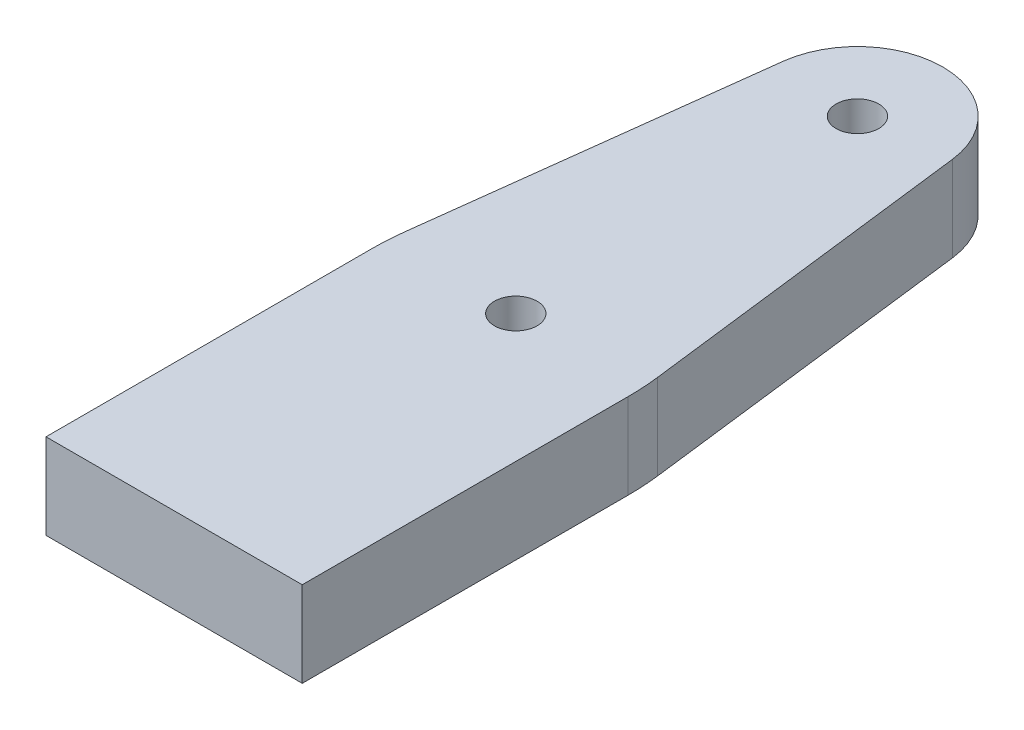
ISO-10303-21;
HEADER;
FILE_DESCRIPTION(('STEP AP214'),'2;1');
FILE_NAME('part.step','',(''),(''),'','','');
FILE_SCHEMA(('AUTOMOTIVE_DESIGN { 1 0 10303 214 1 1 1 1 }'));
ENDSEC;
DATA;
#1=APPLICATION_CONTEXT('core data for automotive mechanical design processes');
#2=APPLICATION_PROTOCOL_DEFINITION('international standard','automotive_design',2000,#1);
#3=PRODUCT_CONTEXT('',#1,'mechanical');
#4=PRODUCT('Part','Part','',(#3));
#5=PRODUCT_RELATED_PRODUCT_CATEGORY('part','',(#4));
#6=PRODUCT_DEFINITION_FORMATION('','',#4);
#7=PRODUCT_DEFINITION_CONTEXT('part definition',#1,'design');
#8=PRODUCT_DEFINITION('design','',#6,#7);
#9=PRODUCT_DEFINITION_SHAPE('','',#8);
#10=(LENGTH_UNIT() NAMED_UNIT(*) SI_UNIT(.MILLI.,.METRE.));
#11=(NAMED_UNIT(*) PLANE_ANGLE_UNIT() SI_UNIT($,.RADIAN.));
#12=(NAMED_UNIT(*) SI_UNIT($,.STERADIAN.) SOLID_ANGLE_UNIT());
#13=UNCERTAINTY_MEASURE_WITH_UNIT(LENGTH_MEASURE(1.E-05),#10,'distance_accuracy_value','');
#14=(GEOMETRIC_REPRESENTATION_CONTEXT(3) GLOBAL_UNCERTAINTY_ASSIGNED_CONTEXT((#13)) GLOBAL_UNIT_ASSIGNED_CONTEXT((#10,
#11,#12)) REPRESENTATION_CONTEXT('',''));
#15=CARTESIAN_POINT('',(0.,0.,0.));
#16=DIRECTION('',(0.,0.,1.));
#17=DIRECTION('',(1.,0.,0.));
#18=AXIS2_PLACEMENT_3D('',#15,#16,#17);
#19=CARTESIAN_POINT('',(4.96253362351675,5.,-0.610950108818783));
#20=DIRECTION('',(-0.992506724703351,0.,0.122190021763757));
#21=DIRECTION('',(0.122190021763757,0.,0.992506724703351));
#22=AXIS2_PLACEMENT_3D('',#19,#20,#21);
#23=PLANE('',#22);
#24=DIRECTION('',(-0.122190021763757,0.,-0.992506724703351));
#25=VECTOR('',#24,1.);
#26=CARTESIAN_POINT('',(4.96253362351675,5.,-0.610950108818783));
#27=LINE('',#26,#25);
#28=CARTESIAN_POINT('',(7.38760087055026,5.,19.0870212622979));
#29=VERTEX_POINT('',#28);
#30=CARTESIAN_POINT('',(4.96253362351675,5.,-0.610950108818783));
#31=VERTEX_POINT('',#30);
#32=EDGE_CURVE('E100',#29,#31,#27,.T.);
#33=ORIENTED_EDGE('',*,*,#32,.F.);
#34=DIRECTION('',(0.,-1.,0.));
#35=VECTOR('',#34,1.);
#36=CARTESIAN_POINT('',(7.38760087055026,0.,19.0870212622979));
#37=LINE('',#36,#35);
#38=CARTESIAN_POINT('',(7.38760087055026,0.,19.0870212622979));
#39=VERTEX_POINT('',#38);
#40=EDGE_CURVE('E125',#29,#39,#37,.T.);
#41=ORIENTED_EDGE('',*,*,#40,.T.);
#42=DIRECTION('',(-0.122190021763757,0.,-0.992506724703351));
#43=VECTOR('',#42,1.);
#44=CARTESIAN_POINT('',(4.96253362351675,0.,-0.610950108818783));
#45=LINE('',#44,#43);
#46=CARTESIAN_POINT('',(4.96253362351675,0.,-0.610950108818783));
#47=VERTEX_POINT('',#46);
#48=EDGE_CURVE('E123',#39,#47,#45,.T.);
#49=ORIENTED_EDGE('',*,*,#48,.T.);
#50=DIRECTION('',(0.,-1.,0.));
#51=VECTOR('',#50,1.);
#52=CARTESIAN_POINT('',(4.96253362351675,5.,-0.610950108818783));
#53=LINE('',#52,#51);
#54=EDGE_CURVE('E117',#31,#47,#53,.T.);
#55=ORIENTED_EDGE('',*,*,#54,.F.);
#56=EDGE_LOOP('',(#33,#41,#49,#55));
#57=FACE_BOUND('',#56,.T.);
#58=ADVANCED_FACE('F37',(#57),#23,.F.);
#59=CARTESIAN_POINT('',(0.,5.,0.));
#60=DIRECTION('',(0.,-1.,0.));
#61=DIRECTION('',(0.,0.,-1.));
#62=AXIS2_PLACEMENT_3D('',#59,#60,#61);
#63=CYLINDRICAL_SURFACE('',#62,5.);
#64=CARTESIAN_POINT('',(0.,0.,0.));
#65=DIRECTION('',(0.,1.,0.));
#66=DIRECTION('',(0.,0.,1.));
#67=AXIS2_PLACEMENT_3D('',#64,#65,#66);
#68=CIRCLE('',#67,5.);
#69=CARTESIAN_POINT('',(-4.96253362351675,0.,-0.610950108818782));
#70=VERTEX_POINT('',#69);
#71=EDGE_CURVE('E158',#47,#70,#68,.T.);
#72=ORIENTED_EDGE('',*,*,#71,.T.);
#73=DIRECTION('',(0.,-1.,0.));
#74=VECTOR('',#73,1.);
#75=CARTESIAN_POINT('',(-4.96253362351675,5.,-0.610950108818782));
#76=LINE('',#75,#74);
#77=CARTESIAN_POINT('',(-4.96253362351675,5.,-0.610950108818782));
#78=VERTEX_POINT('',#77);
#79=EDGE_CURVE('E119',#78,#70,#76,.T.);
#80=ORIENTED_EDGE('',*,*,#79,.F.);
#81=CARTESIAN_POINT('',(0.,5.,0.));
#82=DIRECTION('',(0.,1.,0.));
#83=DIRECTION('',(0.,0.,1.));
#84=AXIS2_PLACEMENT_3D('',#81,#82,#83);
#85=CIRCLE('',#84,5.);
#86=EDGE_CURVE('E104',#31,#78,#85,.T.);
#87=ORIENTED_EDGE('',*,*,#86,.F.);
#88=ORIENTED_EDGE('',*,*,#54,.T.);
#89=EDGE_LOOP('',(#72,#80,#87,#88));
#90=FACE_BOUND('',#89,.T.);
#91=ADVANCED_FACE('F116',(#90),#63,.T.);
#92=CARTESIAN_POINT('',(-4.96253362351675,5.,-0.610950108818782));
#93=DIRECTION('',(0.992506724703351,0.,0.122190021763756));
#94=DIRECTION('',(0.122190021763756,0.,-0.992506724703351));
#95=AXIS2_PLACEMENT_3D('',#92,#93,#94);
#96=PLANE('',#95);
#97=DIRECTION('',(-0.122190021763756,0.,0.992506724703351));
#98=VECTOR('',#97,1.);
#99=CARTESIAN_POINT('',(-4.96253362351675,0.,-0.610950108818782));
#100=LINE('',#99,#98);
#101=CARTESIAN_POINT('',(-7.38760087055026,0.,19.0870212622979));
#102=VERTEX_POINT('',#101);
#103=EDGE_CURVE('E155',#70,#102,#100,.T.);
#104=ORIENTED_EDGE('',*,*,#103,.T.);
#105=DIRECTION('',(0.,-1.,0.));
#106=VECTOR('',#105,1.);
#107=CARTESIAN_POINT('',(-7.38760087055026,5.,19.0870212622979));
#108=LINE('',#107,#106);
#109=CARTESIAN_POINT('',(-7.38760087055026,5.,19.0870212622979));
#110=VERTEX_POINT('',#109);
#111=EDGE_CURVE('E11',#102,#110,#108,.F.);
#112=ORIENTED_EDGE('',*,*,#111,.T.);
#113=DIRECTION('',(-0.122190021763756,0.,0.992506724703351));
#114=VECTOR('',#113,1.);
#115=CARTESIAN_POINT('',(-4.96253362351675,5.,-0.610950108818782));
#116=LINE('',#115,#114);
#117=EDGE_CURVE('E120',#78,#110,#116,.T.);
#118=ORIENTED_EDGE('',*,*,#117,.F.);
#119=ORIENTED_EDGE('',*,*,#79,.T.);
#120=EDGE_LOOP('',(#104,#112,#118,#119));
#121=FACE_BOUND('',#120,.T.);
#122=ADVANCED_FACE('F178',(#121),#96,.F.);
#123=CARTESIAN_POINT('',(-7.5,5.,0.));
#124=DIRECTION('',(1.,0.,0.));
#125=DIRECTION('',(0.,0.,-1.));
#126=AXIS2_PLACEMENT_3D('',#123,#124,#125);
#127=PLANE('',#126);
#128=DIRECTION('',(0.,0.,1.));
#129=VECTOR('',#128,1.);
#130=CARTESIAN_POINT('',(-7.5,5.,0.));
#131=LINE('',#130,#129);
#132=CARTESIAN_POINT('',(-7.5,5.,20.9198715887542));
#133=VERTEX_POINT('',#132);
#134=CARTESIAN_POINT('',(-7.49999999999999,5.,40.));
#135=VERTEX_POINT('',#134);
#136=EDGE_CURVE('E147',#133,#135,#131,.T.);
#137=ORIENTED_EDGE('',*,*,#136,.F.);
#138=DIRECTION('',(0.,-1.,0.));
#139=VECTOR('',#138,1.);
#140=CARTESIAN_POINT('',(-7.5,5.,20.9198715887542));
#141=LINE('',#140,#139);
#142=CARTESIAN_POINT('',(-7.5,0.,20.9198715887542));
#143=VERTEX_POINT('',#142);
#144=EDGE_CURVE('E45',#133,#143,#141,.T.);
#145=ORIENTED_EDGE('',*,*,#144,.T.);
#146=DIRECTION('',(0.,0.,1.));
#147=VECTOR('',#146,1.);
#148=CARTESIAN_POINT('',(-7.5,0.,0.));
#149=LINE('',#148,#147);
#150=CARTESIAN_POINT('',(-7.49999999999999,0.,40.));
#151=VERTEX_POINT('',#150);
#152=EDGE_CURVE('E145',#143,#151,#149,.T.);
#153=ORIENTED_EDGE('',*,*,#152,.T.);
#154=DIRECTION('',(0.,-1.,0.));
#155=VECTOR('',#154,1.);
#156=CARTESIAN_POINT('',(-7.49999999999999,5.,40.));
#157=LINE('',#156,#155);
#158=EDGE_CURVE('E129',#135,#151,#157,.T.);
#159=ORIENTED_EDGE('',*,*,#158,.F.);
#160=EDGE_LOOP('',(#137,#145,#153,#159));
#161=FACE_BOUND('',#160,.T.);
#162=ADVANCED_FACE('F143',(#161),#127,.F.);
#163=CARTESIAN_POINT('',(0.,5.,40.));
#164=DIRECTION('',(0.,0.,1.));
#165=DIRECTION('',(1.,0.,0.));
#166=AXIS2_PLACEMENT_3D('',#163,#164,#165);
#167=PLANE('',#166);
#168=DIRECTION('',(-1.,0.,0.));
#169=VECTOR('',#168,1.);
#170=CARTESIAN_POINT('',(0.,0.,40.));
#171=LINE('',#170,#169);
#172=CARTESIAN_POINT('',(7.50000000000001,0.,40.));
#173=VERTEX_POINT('',#172);
#174=EDGE_CURVE('E154',#173,#151,#171,.T.);
#175=ORIENTED_EDGE('',*,*,#174,.F.);
#176=DIRECTION('',(0.,-1.,0.));
#177=VECTOR('',#176,1.);
#178=CARTESIAN_POINT('',(7.50000000000001,5.,40.));
#179=LINE('',#178,#177);
#180=CARTESIAN_POINT('',(7.50000000000001,5.,40.));
#181=VERTEX_POINT('',#180);
#182=EDGE_CURVE('E163',#181,#173,#179,.T.);
#183=ORIENTED_EDGE('',*,*,#182,.F.);
#184=DIRECTION('',(-1.,0.,0.));
#185=VECTOR('',#184,1.);
#186=CARTESIAN_POINT('',(0.,5.,40.));
#187=LINE('',#186,#185);
#188=EDGE_CURVE('E171',#181,#135,#187,.T.);
#189=ORIENTED_EDGE('',*,*,#188,.T.);
#190=ORIENTED_EDGE('',*,*,#158,.T.);
#191=EDGE_LOOP('',(#175,#183,#189,#190));
#192=FACE_BOUND('',#191,.T.);
#193=ADVANCED_FACE('F168',(#192),#167,.T.);
#194=CARTESIAN_POINT('',(7.5,5.,0.));
#195=DIRECTION('',(1.,0.,0.));
#196=DIRECTION('',(0.,0.,-1.));
#197=AXIS2_PLACEMENT_3D('',#194,#195,#196);
#198=PLANE('',#197);
#199=DIRECTION('',(0.,0.,1.));
#200=VECTOR('',#199,1.);
#201=CARTESIAN_POINT('',(7.5,0.,0.));
#202=LINE('',#201,#200);
#203=CARTESIAN_POINT('',(7.5,0.,20.9198715887542));
#204=VERTEX_POINT('',#203);
#205=EDGE_CURVE('E112',#204,#173,#202,.T.);
#206=ORIENTED_EDGE('',*,*,#205,.F.);
#207=DIRECTION('',(0.,-1.,0.));
#208=VECTOR('',#207,1.);
#209=CARTESIAN_POINT('',(7.5,5.,20.9198715887542));
#210=LINE('',#209,#208);
#211=CARTESIAN_POINT('',(7.5,5.,20.9198715887542));
#212=VERTEX_POINT('',#211);
#213=EDGE_CURVE('E136',#204,#212,#210,.F.);
#214=ORIENTED_EDGE('',*,*,#213,.T.);
#215=DIRECTION('',(0.,0.,1.));
#216=VECTOR('',#215,1.);
#217=CARTESIAN_POINT('',(7.5,5.,0.));
#218=LINE('',#217,#216);
#219=EDGE_CURVE('E165',#212,#181,#218,.T.);
#220=ORIENTED_EDGE('',*,*,#219,.T.);
#221=ORIENTED_EDGE('',*,*,#182,.T.);
#222=EDGE_LOOP('',(#206,#214,#220,#221));
#223=FACE_BOUND('',#222,.T.);
#224=ADVANCED_FACE('F203',(#223),#198,.T.);
#225=CARTESIAN_POINT('',(0.,5.,0.));
#226=DIRECTION('',(0.,1.,0.));
#227=DIRECTION('',(0.,0.,1.));
#228=AXIS2_PLACEMENT_3D('',#225,#226,#227);
#229=PLANE('',#228);
#230=CARTESIAN_POINT('',(0.,5.,0.));
#231=DIRECTION('',(0.,1.,0.));
#232=DIRECTION('',(0.,0.,1.));
#233=AXIS2_PLACEMENT_3D('',#230,#231,#232);
#234=CIRCLE('',#233,1.25);
#235=CARTESIAN_POINT('',(0.,5.,1.25));
#236=VERTEX_POINT('',#235);
#237=EDGE_CURVE('E186',#236,#236,#234,.T.);
#238=ORIENTED_EDGE('',*,*,#237,.F.);
#239=EDGE_LOOP('',(#238));
#240=FACE_BOUND('',#239,.T.);
#241=CARTESIAN_POINT('',(0.,5.,20.));
#242=DIRECTION('',(0.,1.,0.));
#243=DIRECTION('',(0.,0.,1.));
#244=AXIS2_PLACEMENT_3D('',#241,#242,#243);
#245=CIRCLE('',#244,1.25);
#246=CARTESIAN_POINT('',(0.,5.,21.25));
#247=VERTEX_POINT('',#246);
#248=EDGE_CURVE('E180',#247,#247,#245,.T.);
#249=ORIENTED_EDGE('',*,*,#248,.F.);
#250=EDGE_LOOP('',(#249));
#251=FACE_BOUND('',#250,.T.);
#252=ORIENTED_EDGE('',*,*,#219,.F.);
#253=CARTESIAN_POINT('',(-7.5,5.,20.9198715887542));
#254=DIRECTION('',(0.,1.,0.));
#255=DIRECTION('',(0.,0.,1.));
#256=AXIS2_PLACEMENT_3D('',#253,#254,#255);
#257=CIRCLE('',#256,15.);
#258=EDGE_CURVE('E107',#212,#29,#257,.T.);
#259=ORIENTED_EDGE('',*,*,#258,.T.);
#260=ORIENTED_EDGE('',*,*,#32,.T.);
#261=ORIENTED_EDGE('',*,*,#86,.T.);
#262=ORIENTED_EDGE('',*,*,#117,.T.);
#263=CARTESIAN_POINT('',(7.5,5.,20.9198715887542));
#264=DIRECTION('',(0.,1.,0.));
#265=DIRECTION('',(0.,0.,1.));
#266=AXIS2_PLACEMENT_3D('',#263,#264,#265);
#267=CIRCLE('',#266,15.);
#268=EDGE_CURVE('E52',#110,#133,#267,.T.);
#269=ORIENTED_EDGE('',*,*,#268,.T.);
#270=ORIENTED_EDGE('',*,*,#136,.T.);
#271=ORIENTED_EDGE('',*,*,#188,.F.);
#272=EDGE_LOOP('',(#252,#259,#260,#261,#262,#269,#270,#271));
#273=FACE_BOUND('',#272,.T.);
#274=ADVANCED_FACE('F103',(#240,#251,#273),#229,.T.);
#275=CARTESIAN_POINT('',(0.,0.,0.));
#276=DIRECTION('',(0.,1.,0.));
#277=DIRECTION('',(0.,0.,1.));
#278=AXIS2_PLACEMENT_3D('',#275,#276,#277);
#279=PLANE('',#278);
#280=CARTESIAN_POINT('',(0.,0.,0.));
#281=DIRECTION('',(0.,1.,0.));
#282=DIRECTION('',(0.,0.,1.));
#283=AXIS2_PLACEMENT_3D('',#280,#281,#282);
#284=CIRCLE('',#283,1.25);
#285=CARTESIAN_POINT('',(0.,0.,1.25));
#286=VERTEX_POINT('',#285);
#287=EDGE_CURVE('E177',#286,#286,#284,.T.);
#288=ORIENTED_EDGE('',*,*,#287,.T.);
#289=EDGE_LOOP('',(#288));
#290=FACE_BOUND('',#289,.T.);
#291=CARTESIAN_POINT('',(0.,0.,20.));
#292=DIRECTION('',(0.,1.,0.));
#293=DIRECTION('',(0.,0.,1.));
#294=AXIS2_PLACEMENT_3D('',#291,#292,#293);
#295=CIRCLE('',#294,1.25);
#296=CARTESIAN_POINT('',(0.,0.,21.25));
#297=VERTEX_POINT('',#296);
#298=EDGE_CURVE('E183',#297,#297,#295,.T.);
#299=ORIENTED_EDGE('',*,*,#298,.T.);
#300=EDGE_LOOP('',(#299));
#301=FACE_BOUND('',#300,.T.);
#302=ORIENTED_EDGE('',*,*,#48,.F.);
#303=CARTESIAN_POINT('',(-7.5,0.,20.9198715887542));
#304=DIRECTION('',(0.,1.,0.));
#305=DIRECTION('',(0.,0.,1.));
#306=AXIS2_PLACEMENT_3D('',#303,#304,#305);
#307=CIRCLE('',#306,15.);
#308=EDGE_CURVE('E134',#39,#204,#307,.F.);
#309=ORIENTED_EDGE('',*,*,#308,.T.);
#310=ORIENTED_EDGE('',*,*,#205,.T.);
#311=ORIENTED_EDGE('',*,*,#174,.T.);
#312=ORIENTED_EDGE('',*,*,#152,.F.);
#313=CARTESIAN_POINT('',(7.5,0.,20.9198715887542));
#314=DIRECTION('',(0.,1.,0.));
#315=DIRECTION('',(0.,0.,1.));
#316=AXIS2_PLACEMENT_3D('',#313,#314,#315);
#317=CIRCLE('',#316,15.);
#318=EDGE_CURVE('E127',#143,#102,#317,.F.);
#319=ORIENTED_EDGE('',*,*,#318,.T.);
#320=ORIENTED_EDGE('',*,*,#103,.F.);
#321=ORIENTED_EDGE('',*,*,#71,.F.);
#322=EDGE_LOOP('',(#302,#309,#310,#311,#312,#319,#320,#321));
#323=FACE_BOUND('',#322,.T.);
#324=ADVANCED_FACE('F151',(#290,#301,#323),#279,.F.);
#325=CARTESIAN_POINT('',(-7.5,5.,20.9198715887542));
#326=DIRECTION('',(0.,1.,0.));
#327=DIRECTION('',(0.,0.,1.));
#328=AXIS2_PLACEMENT_3D('',#325,#326,#327);
#329=CYLINDRICAL_SURFACE('',#328,15.);
#330=ORIENTED_EDGE('',*,*,#258,.F.);
#331=ORIENTED_EDGE('',*,*,#213,.F.);
#332=ORIENTED_EDGE('',*,*,#308,.F.);
#333=ORIENTED_EDGE('',*,*,#40,.F.);
#334=EDGE_LOOP('',(#330,#331,#332,#333));
#335=FACE_BOUND('',#334,.T.);
#336=ADVANCED_FACE('F213',(#335),#329,.T.);
#337=CARTESIAN_POINT('',(7.5,5.,20.9198715887542));
#338=DIRECTION('',(0.,-1.,0.));
#339=DIRECTION('',(0.,0.,-1.));
#340=AXIS2_PLACEMENT_3D('',#337,#338,#339);
#341=CYLINDRICAL_SURFACE('',#340,15.);
#342=ORIENTED_EDGE('',*,*,#268,.F.);
#343=ORIENTED_EDGE('',*,*,#111,.F.);
#344=ORIENTED_EDGE('',*,*,#318,.F.);
#345=ORIENTED_EDGE('',*,*,#144,.F.);
#346=EDGE_LOOP('',(#342,#343,#344,#345));
#347=FACE_BOUND('',#346,.T.);
#348=ADVANCED_FACE('F39',(#347),#341,.T.);
#349=CARTESIAN_POINT('',(0.,0.,20.));
#350=DIRECTION('',(0.,1.,0.));
#351=DIRECTION('',(0.,0.,1.));
#352=AXIS2_PLACEMENT_3D('',#349,#350,#351);
#353=CYLINDRICAL_SURFACE('',#352,1.25);
#354=ORIENTED_EDGE('',*,*,#298,.F.);
#355=EDGE_LOOP('',(#354));
#356=FACE_BOUND('',#355,.T.);
#357=ORIENTED_EDGE('',*,*,#248,.T.);
#358=EDGE_LOOP('',(#357));
#359=FACE_BOUND('',#358,.T.);
#360=ADVANCED_FACE('F197',(#356,#359),#353,.F.);
#361=CARTESIAN_POINT('',(0.,0.,0.));
#362=DIRECTION('',(0.,1.,0.));
#363=DIRECTION('',(0.,0.,1.));
#364=AXIS2_PLACEMENT_3D('',#361,#362,#363);
#365=CYLINDRICAL_SURFACE('',#364,1.25);
#366=ORIENTED_EDGE('',*,*,#287,.F.);
#367=EDGE_LOOP('',(#366));
#368=FACE_BOUND('',#367,.T.);
#369=ORIENTED_EDGE('',*,*,#237,.T.);
#370=EDGE_LOOP('',(#369));
#371=FACE_BOUND('',#370,.T.);
#372=ADVANCED_FACE('F194',(#368,#371),#365,.F.);
#373=CLOSED_SHELL('',(#58,#91,#122,#162,#193,#224,#274,#324,#336,#348,#360,#372));
#374=MANIFOLD_SOLID_BREP('B2',#373);
#375=ADVANCED_BREP_SHAPE_REPRESENTATION('',(#18,#374),#14);
#376=SHAPE_DEFINITION_REPRESENTATION(#9,#375);
ENDSEC;
END-ISO-10303-21;
